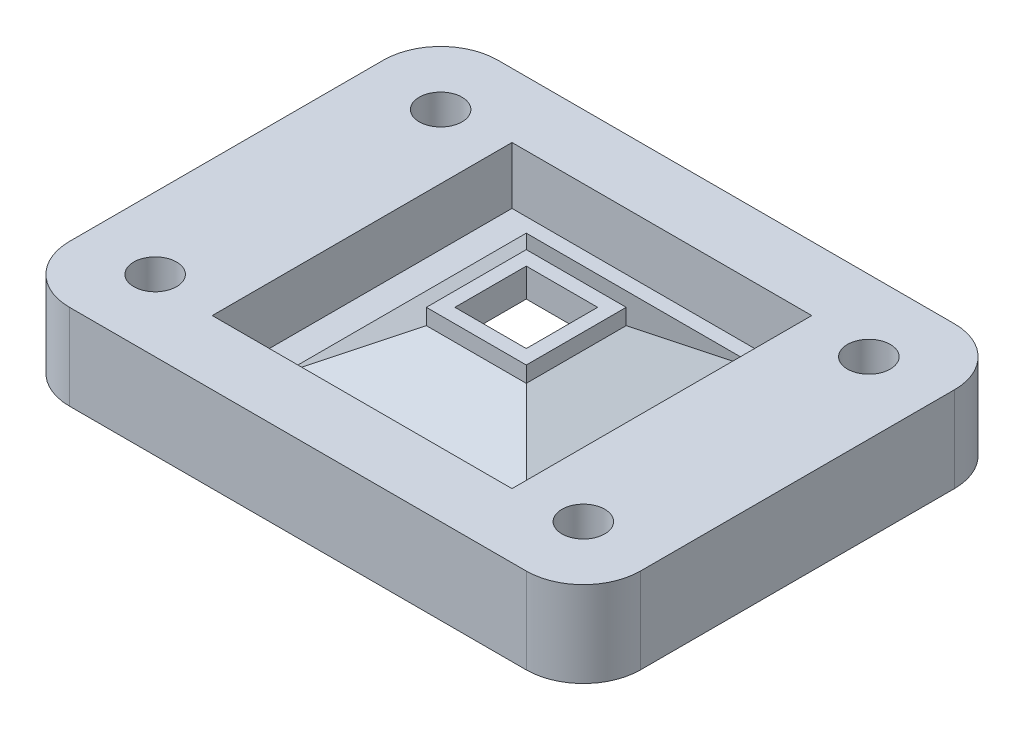
ISO-10303-21;
HEADER;
FILE_DESCRIPTION(('STEP AP214'),'2;1');
FILE_NAME('part.step','',(''),(''),'','','');
FILE_SCHEMA(('AUTOMOTIVE_DESIGN { 1 0 10303 214 1 1 1 1 }'));
ENDSEC;
DATA;
#1=APPLICATION_CONTEXT('core data for automotive mechanical design processes');
#2=APPLICATION_PROTOCOL_DEFINITION('international standard','automotive_design',2000,#1);
#3=PRODUCT_CONTEXT('',#1,'mechanical');
#4=PRODUCT('Part','Part','',(#3));
#5=PRODUCT_RELATED_PRODUCT_CATEGORY('part','',(#4));
#6=PRODUCT_DEFINITION_FORMATION('','',#4);
#7=PRODUCT_DEFINITION_CONTEXT('part definition',#1,'design');
#8=PRODUCT_DEFINITION('design','',#6,#7);
#9=PRODUCT_DEFINITION_SHAPE('','',#8);
#10=(LENGTH_UNIT() NAMED_UNIT(*) SI_UNIT(.MILLI.,.METRE.));
#11=(NAMED_UNIT(*) PLANE_ANGLE_UNIT() SI_UNIT($,.RADIAN.));
#12=(NAMED_UNIT(*) SI_UNIT($,.STERADIAN.) SOLID_ANGLE_UNIT());
#13=UNCERTAINTY_MEASURE_WITH_UNIT(LENGTH_MEASURE(1.E-05),#10,'distance_accuracy_value','');
#14=(GEOMETRIC_REPRESENTATION_CONTEXT(3) GLOBAL_UNCERTAINTY_ASSIGNED_CONTEXT((#13)) GLOBAL_UNIT_ASSIGNED_CONTEXT((#10,
#11,#12)) REPRESENTATION_CONTEXT('',''));
#15=CARTESIAN_POINT('',(0.,0.,0.));
#16=DIRECTION('',(0.,0.,1.));
#17=DIRECTION('',(1.,0.,0.));
#18=AXIS2_PLACEMENT_3D('',#15,#16,#17);
#19=CARTESIAN_POINT('',(0.,2.,0.));
#20=DIRECTION('',(0.,-1.,0.));
#21=DIRECTION('',(0.,0.,-1.));
#22=AXIS2_PLACEMENT_3D('',#19,#20,#21);
#23=PLANE('',#22);
#24=DIRECTION('',(-1.,0.,0.));
#25=VECTOR('',#24,1.);
#26=CARTESIAN_POINT('',(16.5,2.,-7.50000000000003));
#27=LINE('',#26,#25);
#28=CARTESIAN_POINT('',(28.5,2.,-7.50000000000003));
#29=VERTEX_POINT('',#28);
#30=CARTESIAN_POINT('',(11.5,2.,-7.50000000000003));
#31=VERTEX_POINT('',#30);
#32=EDGE_CURVE('E396',#29,#31,#27,.T.);
#33=ORIENTED_EDGE('',*,*,#32,.T.);
#34=DIRECTION('',(0.,0.,-1.));
#35=VECTOR('',#34,1.);
#36=CARTESIAN_POINT('',(11.5,2.,-19.5));
#37=LINE('',#36,#35);
#38=CARTESIAN_POINT('',(11.5,2.,-24.5));
#39=VERTEX_POINT('',#38);
#40=EDGE_CURVE('E402',#31,#39,#37,.T.);
#41=ORIENTED_EDGE('',*,*,#40,.T.);
#42=DIRECTION('',(1.,0.,0.));
#43=VECTOR('',#42,1.);
#44=CARTESIAN_POINT('',(23.5,2.,-24.5));
#45=LINE('',#44,#43);
#46=CARTESIAN_POINT('',(28.5,2.,-24.5));
#47=VERTEX_POINT('',#46);
#48=EDGE_CURVE('E400',#39,#47,#45,.T.);
#49=ORIENTED_EDGE('',*,*,#48,.T.);
#50=DIRECTION('',(0.,0.,1.));
#51=VECTOR('',#50,1.);
#52=CARTESIAN_POINT('',(28.5,2.,-12.5));
#53=LINE('',#52,#51);
#54=EDGE_CURVE('E398',#47,#29,#53,.T.);
#55=ORIENTED_EDGE('',*,*,#54,.T.);
#56=EDGE_LOOP('',(#33,#41,#49,#55));
#57=FACE_BOUND('',#56,.T.);
#58=DIRECTION('',(0.,0.,1.));
#59=VECTOR('',#58,1.);
#60=CARTESIAN_POINT('',(9.5,2.,-4.5));
#61=LINE('',#60,#59);
#62=CARTESIAN_POINT('',(9.5,2.,-25.5));
#63=VERTEX_POINT('',#62);
#64=CARTESIAN_POINT('',(9.5,2.,-4.5));
#65=VERTEX_POINT('',#64);
#66=EDGE_CURVE('E253',#63,#65,#61,.T.);
#67=ORIENTED_EDGE('',*,*,#66,.T.);
#68=DIRECTION('',(1.,0.,0.));
#69=VECTOR('',#68,1.);
#70=CARTESIAN_POINT('',(9.5,2.,-4.5));
#71=LINE('',#70,#69);
#72=CARTESIAN_POINT('',(30.5,2.,-4.5));
#73=VERTEX_POINT('',#72);
#74=EDGE_CURVE('E256',#65,#73,#71,.T.);
#75=ORIENTED_EDGE('',*,*,#74,.T.);
#76=DIRECTION('',(0.,0.,-1.));
#77=VECTOR('',#76,1.);
#78=CARTESIAN_POINT('',(30.5,2.,-4.5));
#79=LINE('',#78,#77);
#80=CARTESIAN_POINT('',(30.5,2.,-25.5));
#81=VERTEX_POINT('',#80);
#82=EDGE_CURVE('E260',#73,#81,#79,.T.);
#83=ORIENTED_EDGE('',*,*,#82,.T.);
#84=DIRECTION('',(-1.,0.,0.));
#85=VECTOR('',#84,1.);
#86=CARTESIAN_POINT('',(9.5,2.,-25.5));
#87=LINE('',#86,#85);
#88=EDGE_CURVE('E263',#81,#63,#87,.T.);
#89=ORIENTED_EDGE('',*,*,#88,.T.);
#90=EDGE_LOOP('',(#67,#75,#83,#89));
#91=FACE_BOUND('',#90,.T.);
#92=ADVANCED_FACE('F35',(#57,#91),#23,.F.);
#93=CARTESIAN_POINT('',(0.,6.,0.));
#94=DIRECTION('',(1.,0.,0.));
#95=DIRECTION('',(0.,0.,-1.));
#96=AXIS2_PLACEMENT_3D('',#93,#94,#95);
#97=PLANE('',#96);
#98=DIRECTION('',(0.,0.,1.));
#99=VECTOR('',#98,1.);
#100=CARTESIAN_POINT('',(0.,6.,0.));
#101=LINE('',#100,#99);
#102=CARTESIAN_POINT('',(0.,6.,-26.));
#103=VERTEX_POINT('',#102);
#104=CARTESIAN_POINT('',(0.,6.,-4.));
#105=VERTEX_POINT('',#104);
#106=EDGE_CURVE('E309',#103,#105,#101,.T.);
#107=ORIENTED_EDGE('',*,*,#106,.F.);
#108=DIRECTION('',(0.,-1.,0.));
#109=VECTOR('',#108,1.);
#110=CARTESIAN_POINT('',(0.,6.,-26.));
#111=LINE('',#110,#109);
#112=CARTESIAN_POINT('',(0.,0.,-26.));
#113=VERTEX_POINT('',#112);
#114=EDGE_CURVE('E334',#103,#113,#111,.T.);
#115=ORIENTED_EDGE('',*,*,#114,.T.);
#116=DIRECTION('',(0.,0.,1.));
#117=VECTOR('',#116,1.);
#118=CARTESIAN_POINT('',(0.,0.,0.));
#119=LINE('',#118,#117);
#120=CARTESIAN_POINT('',(0.,0.,-4.));
#121=VERTEX_POINT('',#120);
#122=EDGE_CURVE('E308',#113,#121,#119,.T.);
#123=ORIENTED_EDGE('',*,*,#122,.T.);
#124=DIRECTION('',(0.,-1.,0.));
#125=VECTOR('',#124,1.);
#126=CARTESIAN_POINT('',(0.,6.,-4.));
#127=LINE('',#126,#125);
#128=EDGE_CURVE('E322',#121,#105,#127,.F.);
#129=ORIENTED_EDGE('',*,*,#128,.T.);
#130=EDGE_LOOP('',(#107,#115,#123,#129));
#131=FACE_BOUND('',#130,.T.);
#132=ADVANCED_FACE('F455',(#131),#97,.F.);
#133=CARTESIAN_POINT('',(0.,6.,0.));
#134=DIRECTION('',(0.,0.,-1.));
#135=DIRECTION('',(-1.,0.,0.));
#136=AXIS2_PLACEMENT_3D('',#133,#134,#135);
#137=PLANE('',#136);
#138=DIRECTION('',(1.,0.,0.));
#139=VECTOR('',#138,1.);
#140=CARTESIAN_POINT('',(0.,0.,0.));
#141=LINE('',#140,#139);
#142=CARTESIAN_POINT('',(4.,0.,0.));
#143=VERTEX_POINT('',#142);
#144=CARTESIAN_POINT('',(36.,0.,0.));
#145=VERTEX_POINT('',#144);
#146=EDGE_CURVE('E325',#143,#145,#141,.T.);
#147=ORIENTED_EDGE('',*,*,#146,.T.);
#148=DIRECTION('',(0.,-1.,0.));
#149=VECTOR('',#148,1.);
#150=CARTESIAN_POINT('',(36.,6.,0.));
#151=LINE('',#150,#149);
#152=CARTESIAN_POINT('',(36.,6.,0.));
#153=VERTEX_POINT('',#152);
#154=EDGE_CURVE('E366',#145,#153,#151,.F.);
#155=ORIENTED_EDGE('',*,*,#154,.T.);
#156=DIRECTION('',(1.,0.,0.));
#157=VECTOR('',#156,1.);
#158=CARTESIAN_POINT('',(0.,6.,0.));
#159=LINE('',#158,#157);
#160=CARTESIAN_POINT('',(4.,6.,0.));
#161=VERTEX_POINT('',#160);
#162=EDGE_CURVE('E312',#161,#153,#159,.T.);
#163=ORIENTED_EDGE('',*,*,#162,.F.);
#164=DIRECTION('',(0.,-1.,0.));
#165=VECTOR('',#164,1.);
#166=CARTESIAN_POINT('',(4.,6.,0.));
#167=LINE('',#166,#165);
#168=EDGE_CURVE('E363',#161,#143,#167,.T.);
#169=ORIENTED_EDGE('',*,*,#168,.T.);
#170=EDGE_LOOP('',(#147,#155,#163,#169));
#171=FACE_BOUND('',#170,.T.);
#172=ADVANCED_FACE('F462',(#171),#137,.F.);
#173=CARTESIAN_POINT('',(40.,6.,0.));
#174=DIRECTION('',(-1.,0.,0.));
#175=DIRECTION('',(0.,0.,1.));
#176=AXIS2_PLACEMENT_3D('',#173,#174,#175);
#177=PLANE('',#176);
#178=DIRECTION('',(0.,0.,-1.));
#179=VECTOR('',#178,1.);
#180=CARTESIAN_POINT('',(40.,0.,0.));
#181=LINE('',#180,#179);
#182=CARTESIAN_POINT('',(40.,0.,-4.));
#183=VERTEX_POINT('',#182);
#184=CARTESIAN_POINT('',(40.,0.,-26.));
#185=VERTEX_POINT('',#184);
#186=EDGE_CURVE('E328',#183,#185,#181,.T.);
#187=ORIENTED_EDGE('',*,*,#186,.T.);
#188=DIRECTION('',(0.,-1.,0.));
#189=VECTOR('',#188,1.);
#190=CARTESIAN_POINT('',(40.,6.,-26.));
#191=LINE('',#190,#189);
#192=CARTESIAN_POINT('',(40.,6.,-26.));
#193=VERTEX_POINT('',#192);
#194=EDGE_CURVE('E361',#185,#193,#191,.F.);
#195=ORIENTED_EDGE('',*,*,#194,.T.);
#196=DIRECTION('',(0.,0.,-1.));
#197=VECTOR('',#196,1.);
#198=CARTESIAN_POINT('',(40.,6.,0.));
#199=LINE('',#198,#197);
#200=CARTESIAN_POINT('',(40.,6.,-4.));
#201=VERTEX_POINT('',#200);
#202=EDGE_CURVE('E316',#201,#193,#199,.T.);
#203=ORIENTED_EDGE('',*,*,#202,.F.);
#204=DIRECTION('',(0.,-1.,0.));
#205=VECTOR('',#204,1.);
#206=CARTESIAN_POINT('',(40.,6.,-4.));
#207=LINE('',#206,#205);
#208=EDGE_CURVE('E358',#201,#183,#207,.T.);
#209=ORIENTED_EDGE('',*,*,#208,.T.);
#210=EDGE_LOOP('',(#187,#195,#203,#209));
#211=FACE_BOUND('',#210,.T.);
#212=ADVANCED_FACE('F513',(#211),#177,.F.);
#213=CARTESIAN_POINT('',(0.,6.,-30.));
#214=DIRECTION('',(0.,0.,1.));
#215=DIRECTION('',(1.,0.,0.));
#216=AXIS2_PLACEMENT_3D('',#213,#214,#215);
#217=PLANE('',#216);
#218=DIRECTION('',(-1.,0.,0.));
#219=VECTOR('',#218,1.);
#220=CARTESIAN_POINT('',(0.,0.,-30.));
#221=LINE('',#220,#219);
#222=CARTESIAN_POINT('',(36.,0.,-30.));
#223=VERTEX_POINT('',#222);
#224=CARTESIAN_POINT('',(4.,0.,-30.));
#225=VERTEX_POINT('',#224);
#226=EDGE_CURVE('E313',#223,#225,#221,.T.);
#227=ORIENTED_EDGE('',*,*,#226,.T.);
#228=DIRECTION('',(0.,-1.,0.));
#229=VECTOR('',#228,1.);
#230=CARTESIAN_POINT('',(4.,6.,-30.));
#231=LINE('',#230,#229);
#232=CARTESIAN_POINT('',(4.,6.,-30.));
#233=VERTEX_POINT('',#232);
#234=EDGE_CURVE('E348',#225,#233,#231,.F.);
#235=ORIENTED_EDGE('',*,*,#234,.T.);
#236=DIRECTION('',(-1.,0.,0.));
#237=VECTOR('',#236,1.);
#238=CARTESIAN_POINT('',(0.,6.,-30.));
#239=LINE('',#238,#237);
#240=CARTESIAN_POINT('',(36.,6.,-30.));
#241=VERTEX_POINT('',#240);
#242=EDGE_CURVE('E319',#241,#233,#239,.T.);
#243=ORIENTED_EDGE('',*,*,#242,.F.);
#244=DIRECTION('',(0.,-1.,0.));
#245=VECTOR('',#244,1.);
#246=CARTESIAN_POINT('',(36.,6.,-30.));
#247=LINE('',#246,#245);
#248=EDGE_CURVE('E345',#241,#223,#247,.T.);
#249=ORIENTED_EDGE('',*,*,#248,.T.);
#250=EDGE_LOOP('',(#227,#235,#243,#249));
#251=FACE_BOUND('',#250,.T.);
#252=ADVANCED_FACE('F506',(#251),#217,.F.);
#253=CARTESIAN_POINT('',(0.,6.,0.));
#254=DIRECTION('',(0.,-1.,0.));
#255=DIRECTION('',(0.,0.,-1.));
#256=AXIS2_PLACEMENT_3D('',#253,#254,#255);
#257=PLANE('',#256);
#258=DIRECTION('',(1.,0.,0.));
#259=VECTOR('',#258,1.);
#260=CARTESIAN_POINT('',(9.5,6.,-4.5));
#261=LINE('',#260,#259);
#262=CARTESIAN_POINT('',(9.5,6.,-4.5));
#263=VERTEX_POINT('',#262);
#264=CARTESIAN_POINT('',(30.5,6.,-4.5));
#265=VERTEX_POINT('',#264);
#266=EDGE_CURVE('E268',#263,#265,#261,.T.);
#267=ORIENTED_EDGE('',*,*,#266,.F.);
#268=DIRECTION('',(0.,0.,1.));
#269=VECTOR('',#268,1.);
#270=CARTESIAN_POINT('',(9.5,6.,-4.5));
#271=LINE('',#270,#269);
#272=CARTESIAN_POINT('',(9.5,6.,-25.5));
#273=VERTEX_POINT('',#272);
#274=EDGE_CURVE('E210',#273,#263,#271,.T.);
#275=ORIENTED_EDGE('',*,*,#274,.F.);
#276=DIRECTION('',(-1.,0.,0.));
#277=VECTOR('',#276,1.);
#278=CARTESIAN_POINT('',(9.5,6.,-25.5));
#279=LINE('',#278,#277);
#280=CARTESIAN_POINT('',(30.5,6.,-25.5));
#281=VERTEX_POINT('',#280);
#282=EDGE_CURVE('E257',#281,#273,#279,.T.);
#283=ORIENTED_EDGE('',*,*,#282,.F.);
#284=DIRECTION('',(0.,0.,-1.));
#285=VECTOR('',#284,1.);
#286=CARTESIAN_POINT('',(30.5,6.,-4.5));
#287=LINE('',#286,#285);
#288=EDGE_CURVE('E271',#265,#281,#287,.T.);
#289=ORIENTED_EDGE('',*,*,#288,.F.);
#290=EDGE_LOOP('',(#267,#275,#283,#289));
#291=FACE_BOUND('',#290,.T.);
#292=CARTESIAN_POINT('',(5.,6.,-25.));
#293=DIRECTION('',(0.,1.,0.));
#294=DIRECTION('',(0.,0.,-1.));
#295=AXIS2_PLACEMENT_3D('',#292,#293,#294);
#296=CIRCLE('',#295,1.5);
#297=CARTESIAN_POINT('',(5.,6.,-26.5));
#298=VERTEX_POINT('',#297);
#299=EDGE_CURVE('E285',#298,#298,#296,.T.);
#300=ORIENTED_EDGE('',*,*,#299,.F.);
#301=EDGE_LOOP('',(#300));
#302=FACE_BOUND('',#301,.T.);
#303=CARTESIAN_POINT('',(35.,6.,-5.));
#304=DIRECTION('',(0.,1.,0.));
#305=DIRECTION('',(0.,0.,-1.));
#306=AXIS2_PLACEMENT_3D('',#303,#304,#305);
#307=CIRCLE('',#306,1.5);
#308=CARTESIAN_POINT('',(35.,6.,-6.5));
#309=VERTEX_POINT('',#308);
#310=EDGE_CURVE('E293',#309,#309,#307,.T.);
#311=ORIENTED_EDGE('',*,*,#310,.F.);
#312=EDGE_LOOP('',(#311));
#313=FACE_BOUND('',#312,.T.);
#314=CARTESIAN_POINT('',(35.,6.,-25.));
#315=DIRECTION('',(0.,1.,0.));
#316=DIRECTION('',(0.,0.,1.));
#317=AXIS2_PLACEMENT_3D('',#314,#315,#316);
#318=CIRCLE('',#317,1.5);
#319=CARTESIAN_POINT('',(35.,6.,-23.5));
#320=VERTEX_POINT('',#319);
#321=EDGE_CURVE('E278',#320,#320,#318,.T.);
#322=ORIENTED_EDGE('',*,*,#321,.F.);
#323=EDGE_LOOP('',(#322));
#324=FACE_BOUND('',#323,.T.);
#325=CARTESIAN_POINT('',(5.,6.,-5.));
#326=DIRECTION('',(0.,1.,0.));
#327=DIRECTION('',(0.,0.,1.));
#328=AXIS2_PLACEMENT_3D('',#325,#326,#327);
#329=CIRCLE('',#328,1.5);
#330=CARTESIAN_POINT('',(5.,6.,-3.5));
#331=VERTEX_POINT('',#330);
#332=EDGE_CURVE('E292',#331,#331,#329,.T.);
#333=ORIENTED_EDGE('',*,*,#332,.F.);
#334=EDGE_LOOP('',(#333));
#335=FACE_BOUND('',#334,.T.);
#336=ORIENTED_EDGE('',*,*,#242,.T.);
#337=CARTESIAN_POINT('',(4.,6.,-26.));
#338=DIRECTION('',(0.,-1.,0.));
#339=DIRECTION('',(0.,0.,-1.));
#340=AXIS2_PLACEMENT_3D('',#337,#338,#339);
#341=CIRCLE('',#340,4.);
#342=EDGE_CURVE('E356',#233,#103,#341,.F.);
#343=ORIENTED_EDGE('',*,*,#342,.T.);
#344=ORIENTED_EDGE('',*,*,#106,.T.);
#345=CARTESIAN_POINT('',(4.,6.,-4.));
#346=DIRECTION('',(0.,-1.,0.));
#347=DIRECTION('',(0.,0.,-1.));
#348=AXIS2_PLACEMENT_3D('',#345,#346,#347);
#349=CIRCLE('',#348,4.);
#350=EDGE_CURVE('E350',#105,#161,#349,.F.);
#351=ORIENTED_EDGE('',*,*,#350,.T.);
#352=ORIENTED_EDGE('',*,*,#162,.T.);
#353=CARTESIAN_POINT('',(36.,6.,-4.));
#354=DIRECTION('',(0.,-1.,0.));
#355=DIRECTION('',(0.,0.,-1.));
#356=AXIS2_PLACEMENT_3D('',#353,#354,#355);
#357=CIRCLE('',#356,4.);
#358=EDGE_CURVE('E352',#153,#201,#357,.F.);
#359=ORIENTED_EDGE('',*,*,#358,.T.);
#360=ORIENTED_EDGE('',*,*,#202,.T.);
#361=CARTESIAN_POINT('',(36.,6.,-26.));
#362=DIRECTION('',(0.,-1.,0.));
#363=DIRECTION('',(0.,0.,-1.));
#364=AXIS2_PLACEMENT_3D('',#361,#362,#363);
#365=CIRCLE('',#364,4.);
#366=EDGE_CURVE('E354',#193,#241,#365,.F.);
#367=ORIENTED_EDGE('',*,*,#366,.T.);
#368=EDGE_LOOP('',(#336,#343,#344,#351,#352,#359,#360,#367));
#369=FACE_BOUND('',#368,.T.);
#370=ADVANCED_FACE('F503',(#291,#302,#313,#324,#335,#369),#257,.F.);
#371=CARTESIAN_POINT('',(0.,0.,0.));
#372=DIRECTION('',(0.,-1.,0.));
#373=DIRECTION('',(0.,0.,-1.));
#374=AXIS2_PLACEMENT_3D('',#371,#372,#373);
#375=PLANE('',#374);
#376=DIRECTION('',(-1.,0.,0.));
#377=VECTOR('',#376,1.);
#378=CARTESIAN_POINT('',(17.5,0.,-25.4282032302755));
#379=LINE('',#378,#377);
#380=CARTESIAN_POINT('',(29.4282032302755,0.,-25.4282032302755));
#381=VERTEX_POINT('',#380);
#382=CARTESIAN_POINT('',(10.5717967697245,0.,-25.4282032302755));
#383=VERTEX_POINT('',#382);
#384=EDGE_CURVE('E368',#381,#383,#379,.T.);
#385=ORIENTED_EDGE('',*,*,#384,.T.);
#386=DIRECTION('',(0.,0.,1.));
#387=VECTOR('',#386,1.);
#388=CARTESIAN_POINT('',(10.5717967697245,0.,-13.5));
#389=LINE('',#388,#387);
#390=CARTESIAN_POINT('',(10.5717967697245,0.,-6.5717967697245));
#391=VERTEX_POINT('',#390);
#392=EDGE_CURVE('E374',#383,#391,#389,.T.);
#393=ORIENTED_EDGE('',*,*,#392,.T.);
#394=DIRECTION('',(1.,0.,0.));
#395=VECTOR('',#394,1.);
#396=CARTESIAN_POINT('',(22.5,0.,-6.5717967697245));
#397=LINE('',#396,#395);
#398=CARTESIAN_POINT('',(29.4282032302755,0.,-6.5717967697245));
#399=VERTEX_POINT('',#398);
#400=EDGE_CURVE('E372',#391,#399,#397,.T.);
#401=ORIENTED_EDGE('',*,*,#400,.T.);
#402=DIRECTION('',(0.,0.,-1.));
#403=VECTOR('',#402,1.);
#404=CARTESIAN_POINT('',(29.4282032302755,0.,-18.5));
#405=LINE('',#404,#403);
#406=EDGE_CURVE('E370',#399,#381,#405,.T.);
#407=ORIENTED_EDGE('',*,*,#406,.T.);
#408=EDGE_LOOP('',(#385,#393,#401,#407));
#409=FACE_BOUND('',#408,.T.);
#410=CARTESIAN_POINT('',(5.,0.,-25.));
#411=DIRECTION('',(0.,-1.,0.));
#412=DIRECTION('',(0.,0.,-1.));
#413=AXIS2_PLACEMENT_3D('',#410,#411,#412);
#414=CIRCLE('',#413,1.5);
#415=CARTESIAN_POINT('',(5.,0.,-26.5));
#416=VERTEX_POINT('',#415);
#417=EDGE_CURVE('E288',#416,#416,#414,.F.);
#418=ORIENTED_EDGE('',*,*,#417,.T.);
#419=EDGE_LOOP('',(#418));
#420=FACE_BOUND('',#419,.T.);
#421=CARTESIAN_POINT('',(35.,0.,-5.));
#422=DIRECTION('',(0.,-1.,0.));
#423=DIRECTION('',(0.,0.,-1.));
#424=AXIS2_PLACEMENT_3D('',#421,#422,#423);
#425=CIRCLE('',#424,1.5);
#426=CARTESIAN_POINT('',(35.,0.,-6.5));
#427=VERTEX_POINT('',#426);
#428=EDGE_CURVE('E289',#427,#427,#425,.F.);
#429=ORIENTED_EDGE('',*,*,#428,.T.);
#430=EDGE_LOOP('',(#429));
#431=FACE_BOUND('',#430,.T.);
#432=CARTESIAN_POINT('',(35.,0.,-25.));
#433=DIRECTION('',(0.,-1.,0.));
#434=DIRECTION('',(0.,0.,-1.));
#435=AXIS2_PLACEMENT_3D('',#432,#433,#434);
#436=CIRCLE('',#435,1.5);
#437=CARTESIAN_POINT('',(35.,0.,-26.5));
#438=VERTEX_POINT('',#437);
#439=EDGE_CURVE('E296',#438,#438,#436,.F.);
#440=ORIENTED_EDGE('',*,*,#439,.T.);
#441=EDGE_LOOP('',(#440));
#442=FACE_BOUND('',#441,.T.);
#443=CARTESIAN_POINT('',(5.,0.,-5.));
#444=DIRECTION('',(0.,-1.,0.));
#445=DIRECTION('',(0.,0.,-1.));
#446=AXIS2_PLACEMENT_3D('',#443,#444,#445);
#447=CIRCLE('',#446,1.5);
#448=CARTESIAN_POINT('',(5.,0.,-6.5));
#449=VERTEX_POINT('',#448);
#450=EDGE_CURVE('E305',#449,#449,#447,.F.);
#451=ORIENTED_EDGE('',*,*,#450,.T.);
#452=EDGE_LOOP('',(#451));
#453=FACE_BOUND('',#452,.T.);
#454=ORIENTED_EDGE('',*,*,#122,.F.);
#455=CARTESIAN_POINT('',(4.,0.,-26.));
#456=DIRECTION('',(0.,-1.,0.));
#457=DIRECTION('',(0.,0.,-1.));
#458=AXIS2_PLACEMENT_3D('',#455,#456,#457);
#459=CIRCLE('',#458,4.);
#460=EDGE_CURVE('E343',#113,#225,#459,.T.);
#461=ORIENTED_EDGE('',*,*,#460,.T.);
#462=ORIENTED_EDGE('',*,*,#226,.F.);
#463=CARTESIAN_POINT('',(36.,0.,-26.));
#464=DIRECTION('',(0.,-1.,0.));
#465=DIRECTION('',(0.,0.,-1.));
#466=AXIS2_PLACEMENT_3D('',#463,#464,#465);
#467=CIRCLE('',#466,4.);
#468=EDGE_CURVE('E341',#223,#185,#467,.T.);
#469=ORIENTED_EDGE('',*,*,#468,.T.);
#470=ORIENTED_EDGE('',*,*,#186,.F.);
#471=CARTESIAN_POINT('',(36.,0.,-4.));
#472=DIRECTION('',(0.,-1.,0.));
#473=DIRECTION('',(0.,0.,-1.));
#474=AXIS2_PLACEMENT_3D('',#471,#472,#473);
#475=CIRCLE('',#474,4.);
#476=EDGE_CURVE('E339',#183,#145,#475,.T.);
#477=ORIENTED_EDGE('',*,*,#476,.T.);
#478=ORIENTED_EDGE('',*,*,#146,.F.);
#479=CARTESIAN_POINT('',(4.,0.,-4.));
#480=DIRECTION('',(0.,-1.,0.));
#481=DIRECTION('',(0.,0.,-1.));
#482=AXIS2_PLACEMENT_3D('',#479,#480,#481);
#483=CIRCLE('',#482,4.);
#484=EDGE_CURVE('E337',#143,#121,#483,.T.);
#485=ORIENTED_EDGE('',*,*,#484,.T.);
#486=EDGE_LOOP('',(#454,#461,#462,#469,#470,#477,#478,#485));
#487=FACE_BOUND('',#486,.T.);
#488=ADVANCED_FACE('F501',(#409,#420,#431,#442,#453,#487),#375,.T.);
#489=CARTESIAN_POINT('',(5.,-4.24264068711928,-5.));
#490=DIRECTION('',(0.,1.,0.));
#491=DIRECTION('',(0.,0.,1.));
#492=AXIS2_PLACEMENT_3D('',#489,#490,#491);
#493=CYLINDRICAL_SURFACE('',#492,1.5);
#494=ORIENTED_EDGE('',*,*,#332,.T.);
#495=EDGE_LOOP('',(#494));
#496=FACE_BOUND('',#495,.T.);
#497=ORIENTED_EDGE('',*,*,#450,.F.);
#498=EDGE_LOOP('',(#497));
#499=FACE_BOUND('',#498,.T.);
#500=ADVANCED_FACE('F497',(#496,#499),#493,.F.);
#501=CARTESIAN_POINT('',(35.,-4.24264068711928,-25.));
#502=DIRECTION('',(0.,1.,0.));
#503=DIRECTION('',(0.,0.,1.));
#504=AXIS2_PLACEMENT_3D('',#501,#502,#503);
#505=CYLINDRICAL_SURFACE('',#504,1.5);
#506=ORIENTED_EDGE('',*,*,#321,.T.);
#507=EDGE_LOOP('',(#506));
#508=FACE_BOUND('',#507,.T.);
#509=ORIENTED_EDGE('',*,*,#439,.F.);
#510=EDGE_LOOP('',(#509));
#511=FACE_BOUND('',#510,.T.);
#512=ADVANCED_FACE('F493',(#508,#511),#505,.F.);
#513=CARTESIAN_POINT('',(35.,-4.24264068711928,-5.));
#514=DIRECTION('',(0.,1.,0.));
#515=DIRECTION('',(0.,0.,1.));
#516=AXIS2_PLACEMENT_3D('',#513,#514,#515);
#517=CYLINDRICAL_SURFACE('',#516,1.5);
#518=ORIENTED_EDGE('',*,*,#310,.T.);
#519=EDGE_LOOP('',(#518));
#520=FACE_BOUND('',#519,.T.);
#521=ORIENTED_EDGE('',*,*,#428,.F.);
#522=EDGE_LOOP('',(#521));
#523=FACE_BOUND('',#522,.T.);
#524=ADVANCED_FACE('F489',(#520,#523),#517,.F.);
#525=CARTESIAN_POINT('',(5.,-4.24264068711928,-25.));
#526=DIRECTION('',(0.,1.,0.));
#527=DIRECTION('',(0.,0.,1.));
#528=AXIS2_PLACEMENT_3D('',#525,#526,#527);
#529=CYLINDRICAL_SURFACE('',#528,1.5);
#530=ORIENTED_EDGE('',*,*,#299,.T.);
#531=EDGE_LOOP('',(#530));
#532=FACE_BOUND('',#531,.T.);
#533=ORIENTED_EDGE('',*,*,#417,.F.);
#534=EDGE_LOOP('',(#533));
#535=FACE_BOUND('',#534,.T.);
#536=ADVANCED_FACE('F485',(#532,#535),#529,.F.);
#537=CARTESIAN_POINT('',(4.,6.,-26.));
#538=DIRECTION('',(0.,-1.,0.));
#539=DIRECTION('',(0.,0.,-1.));
#540=AXIS2_PLACEMENT_3D('',#537,#538,#539);
#541=CYLINDRICAL_SURFACE('',#540,4.);
#542=ORIENTED_EDGE('',*,*,#342,.F.);
#543=ORIENTED_EDGE('',*,*,#234,.F.);
#544=ORIENTED_EDGE('',*,*,#460,.F.);
#545=ORIENTED_EDGE('',*,*,#114,.F.);
#546=EDGE_LOOP('',(#542,#543,#544,#545));
#547=FACE_BOUND('',#546,.T.);
#548=ADVANCED_FACE('F488',(#547),#541,.T.);
#549=CARTESIAN_POINT('',(36.,6.,-26.));
#550=DIRECTION('',(0.,-1.,0.));
#551=DIRECTION('',(0.,0.,-1.));
#552=AXIS2_PLACEMENT_3D('',#549,#550,#551);
#553=CYLINDRICAL_SURFACE('',#552,4.);
#554=ORIENTED_EDGE('',*,*,#366,.F.);
#555=ORIENTED_EDGE('',*,*,#194,.F.);
#556=ORIENTED_EDGE('',*,*,#468,.F.);
#557=ORIENTED_EDGE('',*,*,#248,.F.);
#558=EDGE_LOOP('',(#554,#555,#556,#557));
#559=FACE_BOUND('',#558,.T.);
#560=ADVANCED_FACE('F523',(#559),#553,.T.);
#561=CARTESIAN_POINT('',(36.,6.,-4.));
#562=DIRECTION('',(0.,-1.,0.));
#563=DIRECTION('',(0.,0.,-1.));
#564=AXIS2_PLACEMENT_3D('',#561,#562,#563);
#565=CYLINDRICAL_SURFACE('',#564,4.);
#566=ORIENTED_EDGE('',*,*,#358,.F.);
#567=ORIENTED_EDGE('',*,*,#154,.F.);
#568=ORIENTED_EDGE('',*,*,#476,.F.);
#569=ORIENTED_EDGE('',*,*,#208,.F.);
#570=EDGE_LOOP('',(#566,#567,#568,#569));
#571=FACE_BOUND('',#570,.T.);
#572=ADVANCED_FACE('F527',(#571),#565,.T.);
#573=CARTESIAN_POINT('',(4.,6.,-4.));
#574=DIRECTION('',(0.,-1.,0.));
#575=DIRECTION('',(0.,0.,-1.));
#576=AXIS2_PLACEMENT_3D('',#573,#574,#575);
#577=CYLINDRICAL_SURFACE('',#576,4.);
#578=ORIENTED_EDGE('',*,*,#350,.F.);
#579=ORIENTED_EDGE('',*,*,#128,.F.);
#580=ORIENTED_EDGE('',*,*,#484,.F.);
#581=ORIENTED_EDGE('',*,*,#168,.F.);
#582=EDGE_LOOP('',(#578,#579,#580,#581));
#583=FACE_BOUND('',#582,.T.);
#584=ADVANCED_FACE('F483',(#583),#577,.T.);
#585=CARTESIAN_POINT('',(9.5,2.,-4.5));
#586=DIRECTION('',(-1.,0.,0.));
#587=DIRECTION('',(0.,0.,1.));
#588=AXIS2_PLACEMENT_3D('',#585,#586,#587);
#589=PLANE('',#588);
#590=ORIENTED_EDGE('',*,*,#274,.T.);
#591=DIRECTION('',(0.,1.,0.));
#592=VECTOR('',#591,1.);
#593=CARTESIAN_POINT('',(9.5,2.,-4.5));
#594=LINE('',#593,#592);
#595=EDGE_CURVE('E266',#65,#263,#594,.T.);
#596=ORIENTED_EDGE('',*,*,#595,.F.);
#597=ORIENTED_EDGE('',*,*,#66,.F.);
#598=DIRECTION('',(0.,1.,0.));
#599=VECTOR('',#598,1.);
#600=CARTESIAN_POINT('',(9.5,2.,-25.5));
#601=LINE('',#600,#599);
#602=EDGE_CURVE('E276',#63,#273,#601,.T.);
#603=ORIENTED_EDGE('',*,*,#602,.T.);
#604=EDGE_LOOP('',(#590,#596,#597,#603));
#605=FACE_BOUND('',#604,.T.);
#606=ADVANCED_FACE('F472',(#605),#589,.F.);
#607=CARTESIAN_POINT('',(9.5,2.,-25.5));
#608=DIRECTION('',(0.,0.,-1.));
#609=DIRECTION('',(-1.,0.,0.));
#610=AXIS2_PLACEMENT_3D('',#607,#608,#609);
#611=PLANE('',#610);
#612=ORIENTED_EDGE('',*,*,#282,.T.);
#613=ORIENTED_EDGE('',*,*,#602,.F.);
#614=ORIENTED_EDGE('',*,*,#88,.F.);
#615=DIRECTION('',(0.,1.,0.));
#616=VECTOR('',#615,1.);
#617=CARTESIAN_POINT('',(30.5,2.,-25.5));
#618=LINE('',#617,#616);
#619=EDGE_CURVE('E279',#81,#281,#618,.T.);
#620=ORIENTED_EDGE('',*,*,#619,.T.);
#621=EDGE_LOOP('',(#612,#613,#614,#620));
#622=FACE_BOUND('',#621,.T.);
#623=ADVANCED_FACE('F468',(#622),#611,.F.);
#624=CARTESIAN_POINT('',(30.5,2.,-4.5));
#625=DIRECTION('',(1.,0.,0.));
#626=DIRECTION('',(0.,0.,-1.));
#627=AXIS2_PLACEMENT_3D('',#624,#625,#626);
#628=PLANE('',#627);
#629=ORIENTED_EDGE('',*,*,#288,.T.);
#630=ORIENTED_EDGE('',*,*,#619,.F.);
#631=ORIENTED_EDGE('',*,*,#82,.F.);
#632=DIRECTION('',(0.,1.,0.));
#633=VECTOR('',#632,1.);
#634=CARTESIAN_POINT('',(30.5,2.,-4.5));
#635=LINE('',#634,#633);
#636=EDGE_CURVE('E281',#73,#265,#635,.T.);
#637=ORIENTED_EDGE('',*,*,#636,.T.);
#638=EDGE_LOOP('',(#629,#630,#631,#637));
#639=FACE_BOUND('',#638,.T.);
#640=ADVANCED_FACE('F471',(#639),#628,.F.);
#641=CARTESIAN_POINT('',(9.5,2.,-4.5));
#642=DIRECTION('',(0.,0.,1.));
#643=DIRECTION('',(1.,0.,0.));
#644=AXIS2_PLACEMENT_3D('',#641,#642,#643);
#645=PLANE('',#644);
#646=ORIENTED_EDGE('',*,*,#266,.T.);
#647=ORIENTED_EDGE('',*,*,#636,.F.);
#648=ORIENTED_EDGE('',*,*,#74,.F.);
#649=ORIENTED_EDGE('',*,*,#595,.T.);
#650=EDGE_LOOP('',(#646,#647,#648,#649));
#651=FACE_BOUND('',#650,.T.);
#652=ADVANCED_FACE('F476',(#651),#645,.F.);
#653=CARTESIAN_POINT('',(17.5,-7.07106781186548,-13.5));
#654=DIRECTION('',(0.,0.,1.));
#655=DIRECTION('',(1.,0.,0.));
#656=AXIS2_PLACEMENT_3D('',#653,#654,#655);
#657=PLANE('',#656);
#658=DIRECTION('',(0.,1.,0.));
#659=VECTOR('',#658,1.);
#660=CARTESIAN_POINT('',(22.5,-7.07106781186548,-13.5));
#661=LINE('',#660,#659);
#662=CARTESIAN_POINT('',(22.5,4.00000000000001,-13.5));
#663=VERTEX_POINT('',#662);
#664=CARTESIAN_POINT('',(22.5,6.,-13.5));
#665=VERTEX_POINT('',#664);
#666=EDGE_CURVE('E248',#663,#665,#661,.T.);
#667=ORIENTED_EDGE('',*,*,#666,.F.);
#668=DIRECTION('',(-1.,0.,0.));
#669=VECTOR('',#668,1.);
#670=CARTESIAN_POINT('',(17.5,4.00000000000001,-13.5));
#671=LINE('',#670,#669);
#672=CARTESIAN_POINT('',(17.5,4.00000000000001,-13.5));
#673=VERTEX_POINT('',#672);
#674=EDGE_CURVE('E206',#663,#673,#671,.T.);
#675=ORIENTED_EDGE('',*,*,#674,.T.);
#676=DIRECTION('',(0.,1.,0.));
#677=VECTOR('',#676,1.);
#678=CARTESIAN_POINT('',(17.5,-7.07106781186548,-13.5));
#679=LINE('',#678,#677);
#680=CARTESIAN_POINT('',(17.5,6.,-13.5));
#681=VERTEX_POINT('',#680);
#682=EDGE_CURVE('E198',#673,#681,#679,.T.);
#683=ORIENTED_EDGE('',*,*,#682,.T.);
#684=DIRECTION('',(1.,0.,0.));
#685=VECTOR('',#684,1.);
#686=CARTESIAN_POINT('',(17.5,6.,-13.5));
#687=LINE('',#686,#685);
#688=EDGE_CURVE('E203',#681,#665,#687,.T.);
#689=ORIENTED_EDGE('',*,*,#688,.T.);
#690=EDGE_LOOP('',(#667,#675,#683,#689));
#691=FACE_BOUND('',#690,.T.);
#692=ADVANCED_FACE('F201',(#691),#657,.F.);
#693=CARTESIAN_POINT('',(22.5,-7.07106781186548,-13.5));
#694=DIRECTION('',(1.,0.,0.));
#695=DIRECTION('',(0.,0.,-1.));
#696=AXIS2_PLACEMENT_3D('',#693,#694,#695);
#697=PLANE('',#696);
#698=DIRECTION('',(0.,1.,0.));
#699=VECTOR('',#698,1.);
#700=CARTESIAN_POINT('',(22.5,-7.07106781186548,-18.5));
#701=LINE('',#700,#699);
#702=CARTESIAN_POINT('',(22.5,4.00000000000001,-18.5));
#703=VERTEX_POINT('',#702);
#704=CARTESIAN_POINT('',(22.5,6.,-18.5));
#705=VERTEX_POINT('',#704);
#706=EDGE_CURVE('E250',#703,#705,#701,.T.);
#707=ORIENTED_EDGE('',*,*,#706,.F.);
#708=DIRECTION('',(0.,0.,1.));
#709=VECTOR('',#708,1.);
#710=CARTESIAN_POINT('',(22.5,4.00000000000001,-13.5));
#711=LINE('',#710,#709);
#712=EDGE_CURVE('E380',#703,#663,#711,.T.);
#713=ORIENTED_EDGE('',*,*,#712,.T.);
#714=ORIENTED_EDGE('',*,*,#666,.T.);
#715=DIRECTION('',(0.,0.,-1.));
#716=VECTOR('',#715,1.);
#717=CARTESIAN_POINT('',(22.5,6.,-18.5));
#718=LINE('',#717,#716);
#719=EDGE_CURVE('E224',#665,#705,#718,.T.);
#720=ORIENTED_EDGE('',*,*,#719,.T.);
#721=EDGE_LOOP('',(#707,#713,#714,#720));
#722=FACE_BOUND('',#721,.T.);
#723=ADVANCED_FACE('F617',(#722),#697,.F.);
#724=CARTESIAN_POINT('',(17.5,-7.07106781186548,-18.5));
#725=DIRECTION('',(0.,0.,-1.));
#726=DIRECTION('',(-1.,0.,0.));
#727=AXIS2_PLACEMENT_3D('',#724,#725,#726);
#728=PLANE('',#727);
#729=DIRECTION('',(0.,1.,0.));
#730=VECTOR('',#729,1.);
#731=CARTESIAN_POINT('',(17.5,-7.07106781186548,-18.5));
#732=LINE('',#731,#730);
#733=CARTESIAN_POINT('',(17.5,4.00000000000001,-18.5));
#734=VERTEX_POINT('',#733);
#735=CARTESIAN_POINT('',(17.5,6.,-18.5));
#736=VERTEX_POINT('',#735);
#737=EDGE_CURVE('E211',#734,#736,#732,.T.);
#738=ORIENTED_EDGE('',*,*,#737,.F.);
#739=DIRECTION('',(1.,0.,0.));
#740=VECTOR('',#739,1.);
#741=CARTESIAN_POINT('',(22.5,4.00000000000001,-18.5));
#742=LINE('',#741,#740);
#743=EDGE_CURVE('E382',#734,#703,#742,.T.);
#744=ORIENTED_EDGE('',*,*,#743,.T.);
#745=ORIENTED_EDGE('',*,*,#706,.T.);
#746=DIRECTION('',(-1.,0.,0.));
#747=VECTOR('',#746,1.);
#748=CARTESIAN_POINT('',(17.5,6.,-18.5));
#749=LINE('',#748,#747);
#750=EDGE_CURVE('E226',#705,#736,#749,.T.);
#751=ORIENTED_EDGE('',*,*,#750,.T.);
#752=EDGE_LOOP('',(#738,#744,#745,#751));
#753=FACE_BOUND('',#752,.T.);
#754=ADVANCED_FACE('F610',(#753),#728,.F.);
#755=CARTESIAN_POINT('',(17.5,-7.07106781186548,-13.5));
#756=DIRECTION('',(-1.,0.,0.));
#757=DIRECTION('',(0.,0.,1.));
#758=AXIS2_PLACEMENT_3D('',#755,#756,#757);
#759=PLANE('',#758);
#760=ORIENTED_EDGE('',*,*,#682,.F.);
#761=DIRECTION('',(0.,0.,-1.));
#762=VECTOR('',#761,1.);
#763=CARTESIAN_POINT('',(17.5,4.00000000000001,-18.5));
#764=LINE('',#763,#762);
#765=EDGE_CURVE('E377',#673,#734,#764,.T.);
#766=ORIENTED_EDGE('',*,*,#765,.T.);
#767=ORIENTED_EDGE('',*,*,#737,.T.);
#768=DIRECTION('',(0.,0.,1.));
#769=VECTOR('',#768,1.);
#770=CARTESIAN_POINT('',(17.5,6.,-18.5));
#771=LINE('',#770,#769);
#772=EDGE_CURVE('E214',#736,#681,#771,.T.);
#773=ORIENTED_EDGE('',*,*,#772,.T.);
#774=EDGE_LOOP('',(#760,#766,#767,#773));
#775=FACE_BOUND('',#774,.T.);
#776=ADVANCED_FACE('F215',(#775),#759,.F.);
#777=CARTESIAN_POINT('',(0.,6.,0.));
#778=DIRECTION('',(0.,1.,0.));
#779=DIRECTION('',(0.,0.,1.));
#780=AXIS2_PLACEMENT_3D('',#777,#778,#779);
#781=PLANE('',#780);
#782=DIRECTION('',(0.,0.,1.));
#783=VECTOR('',#782,1.);
#784=CARTESIAN_POINT('',(16.5,6.,-19.5));
#785=LINE('',#784,#783);
#786=CARTESIAN_POINT('',(16.5,6.,-19.5));
#787=VERTEX_POINT('',#786);
#788=CARTESIAN_POINT('',(16.5,6.,-12.5));
#789=VERTEX_POINT('',#788);
#790=EDGE_CURVE('E230',#787,#789,#785,.T.);
#791=ORIENTED_EDGE('',*,*,#790,.T.);
#792=DIRECTION('',(1.,0.,0.));
#793=VECTOR('',#792,1.);
#794=CARTESIAN_POINT('',(16.5,6.,-12.5));
#795=LINE('',#794,#793);
#796=CARTESIAN_POINT('',(23.5,6.,-12.5));
#797=VERTEX_POINT('',#796);
#798=EDGE_CURVE('E233',#789,#797,#795,.T.);
#799=ORIENTED_EDGE('',*,*,#798,.T.);
#800=DIRECTION('',(0.,0.,-1.));
#801=VECTOR('',#800,1.);
#802=CARTESIAN_POINT('',(23.5,6.,-12.5));
#803=LINE('',#802,#801);
#804=CARTESIAN_POINT('',(23.5,6.,-19.5));
#805=VERTEX_POINT('',#804);
#806=EDGE_CURVE('E235',#797,#805,#803,.T.);
#807=ORIENTED_EDGE('',*,*,#806,.T.);
#808=DIRECTION('',(-1.,0.,0.));
#809=VECTOR('',#808,1.);
#810=CARTESIAN_POINT('',(23.5,6.,-19.5));
#811=LINE('',#810,#809);
#812=EDGE_CURVE('E237',#805,#787,#811,.T.);
#813=ORIENTED_EDGE('',*,*,#812,.T.);
#814=EDGE_LOOP('',(#791,#799,#807,#813));
#815=FACE_BOUND('',#814,.T.);
#816=ORIENTED_EDGE('',*,*,#688,.F.);
#817=ORIENTED_EDGE('',*,*,#772,.F.);
#818=ORIENTED_EDGE('',*,*,#750,.F.);
#819=ORIENTED_EDGE('',*,*,#719,.F.);
#820=EDGE_LOOP('',(#816,#817,#818,#819));
#821=FACE_BOUND('',#820,.T.);
#822=ADVANCED_FACE('F222',(#815,#821),#781,.T.);
#823=CARTESIAN_POINT('',(16.5,6.,-19.5));
#824=DIRECTION('',(1.,0.,0.));
#825=DIRECTION('',(0.,0.,-1.));
#826=AXIS2_PLACEMENT_3D('',#823,#824,#825);
#827=PLANE('',#826);
#828=DIRECTION('',(0.,-1.,0.));
#829=VECTOR('',#828,1.);
#830=CARTESIAN_POINT('',(16.5,6.,-19.5));
#831=LINE('',#830,#829);
#832=CARTESIAN_POINT('',(16.5,4.88675134594814,-19.5));
#833=VERTEX_POINT('',#832);
#834=EDGE_CURVE('E239',#787,#833,#831,.T.);
#835=ORIENTED_EDGE('',*,*,#834,.T.);
#836=DIRECTION('',(0.,0.,1.));
#837=VECTOR('',#836,1.);
#838=CARTESIAN_POINT('',(16.5,4.88675134594814,-12.5));
#839=LINE('',#838,#837);
#840=CARTESIAN_POINT('',(16.5,4.88675134594814,-12.5));
#841=VERTEX_POINT('',#840);
#842=EDGE_CURVE('E384',#833,#841,#839,.T.);
#843=ORIENTED_EDGE('',*,*,#842,.T.);
#844=DIRECTION('',(0.,-1.,0.));
#845=VECTOR('',#844,1.);
#846=CARTESIAN_POINT('',(16.5,6.,-12.5));
#847=LINE('',#846,#845);
#848=EDGE_CURVE('E246',#789,#841,#847,.T.);
#849=ORIENTED_EDGE('',*,*,#848,.F.);
#850=ORIENTED_EDGE('',*,*,#790,.F.);
#851=EDGE_LOOP('',(#835,#843,#849,#850));
#852=FACE_BOUND('',#851,.T.);
#853=ADVANCED_FACE('F435',(#852),#827,.F.);
#854=CARTESIAN_POINT('',(16.5,6.,-12.5));
#855=DIRECTION('',(0.,0.,-1.));
#856=DIRECTION('',(-1.,0.,0.));
#857=AXIS2_PLACEMENT_3D('',#854,#855,#856);
#858=PLANE('',#857);
#859=ORIENTED_EDGE('',*,*,#848,.T.);
#860=DIRECTION('',(1.,0.,0.));
#861=VECTOR('',#860,1.);
#862=CARTESIAN_POINT('',(23.5,4.88675134594814,-12.5));
#863=LINE('',#862,#861);
#864=CARTESIAN_POINT('',(23.5,4.88675134594814,-12.5));
#865=VERTEX_POINT('',#864);
#866=EDGE_CURVE('E11',#841,#865,#863,.T.);
#867=ORIENTED_EDGE('',*,*,#866,.T.);
#868=DIRECTION('',(0.,-1.,0.));
#869=VECTOR('',#868,1.);
#870=CARTESIAN_POINT('',(23.5,6.,-12.5));
#871=LINE('',#870,#869);
#872=EDGE_CURVE('E244',#797,#865,#871,.T.);
#873=ORIENTED_EDGE('',*,*,#872,.F.);
#874=ORIENTED_EDGE('',*,*,#798,.F.);
#875=EDGE_LOOP('',(#859,#867,#873,#874));
#876=FACE_BOUND('',#875,.T.);
#877=ADVANCED_FACE('F438',(#876),#858,.F.);
#878=CARTESIAN_POINT('',(23.5,6.,-12.5));
#879=DIRECTION('',(-1.,0.,0.));
#880=DIRECTION('',(0.,0.,1.));
#881=AXIS2_PLACEMENT_3D('',#878,#879,#880);
#882=PLANE('',#881);
#883=ORIENTED_EDGE('',*,*,#872,.T.);
#884=DIRECTION('',(0.,0.,-1.));
#885=VECTOR('',#884,1.);
#886=CARTESIAN_POINT('',(23.5,4.88675134594814,-19.5));
#887=LINE('',#886,#885);
#888=CARTESIAN_POINT('',(23.5,4.88675134594814,-19.5));
#889=VERTEX_POINT('',#888);
#890=EDGE_CURVE('E44',#865,#889,#887,.T.);
#891=ORIENTED_EDGE('',*,*,#890,.T.);
#892=DIRECTION('',(0.,-1.,0.));
#893=VECTOR('',#892,1.);
#894=CARTESIAN_POINT('',(23.5,6.,-19.5));
#895=LINE('',#894,#893);
#896=EDGE_CURVE('E242',#805,#889,#895,.T.);
#897=ORIENTED_EDGE('',*,*,#896,.F.);
#898=ORIENTED_EDGE('',*,*,#806,.F.);
#899=EDGE_LOOP('',(#883,#891,#897,#898));
#900=FACE_BOUND('',#899,.T.);
#901=ADVANCED_FACE('F444',(#900),#882,.F.);
#902=CARTESIAN_POINT('',(23.5,6.,-19.5));
#903=DIRECTION('',(0.,0.,1.));
#904=DIRECTION('',(1.,0.,0.));
#905=AXIS2_PLACEMENT_3D('',#902,#903,#904);
#906=PLANE('',#905);
#907=ORIENTED_EDGE('',*,*,#896,.T.);
#908=DIRECTION('',(-1.,0.,0.));
#909=VECTOR('',#908,1.);
#910=CARTESIAN_POINT('',(16.5,4.88675134594814,-19.5));
#911=LINE('',#910,#909);
#912=EDGE_CURVE('E405',#889,#833,#911,.T.);
#913=ORIENTED_EDGE('',*,*,#912,.T.);
#914=ORIENTED_EDGE('',*,*,#834,.F.);
#915=ORIENTED_EDGE('',*,*,#812,.F.);
#916=EDGE_LOOP('',(#907,#913,#914,#915));
#917=FACE_BOUND('',#916,.T.);
#918=ADVANCED_FACE('F443',(#917),#906,.F.);
#919=CARTESIAN_POINT('',(29.4282032302755,0.,0.));
#920=DIRECTION('',(-0.500000000000001,-0.866025403784438,0.));
#921=DIRECTION('',(0.,0.,1.));
#922=AXIS2_PLACEMENT_3D('',#919,#920,#921);
#923=PLANE('',#922);
#924=DIRECTION('',(-0.654653670707977,0.377964473009228,-0.654653670707977));
#925=VECTOR('',#924,1.);
#926=CARTESIAN_POINT('',(16.816116131586,7.28159188147141,-19.183883868414));
#927=LINE('',#926,#925);
#928=EDGE_CURVE('E389',#663,#399,#927,.F.);
#929=ORIENTED_EDGE('',*,*,#928,.F.);
#930=ORIENTED_EDGE('',*,*,#712,.F.);
#931=DIRECTION('',(-0.654653670707977,0.377964473009228,0.654653670707977));
#932=VECTOR('',#931,1.);
#933=CARTESIAN_POINT('',(18.5304018458717,6.29184856286061,-14.5304018458717));
#934=LINE('',#933,#932);
#935=EDGE_CURVE('E220',#381,#703,#934,.T.);
#936=ORIENTED_EDGE('',*,*,#935,.F.);
#937=ORIENTED_EDGE('',*,*,#406,.F.);
#938=EDGE_LOOP('',(#929,#930,#936,#937));
#939=FACE_BOUND('',#938,.T.);
#940=ADVANCED_FACE('F451',(#939),#923,.T.);
#941=CARTESIAN_POINT('',(0.,0.,-25.4282032302755));
#942=DIRECTION('',(0.,-0.866025403784438,0.500000000000001));
#943=DIRECTION('',(1.,0.,0.));
#944=AXIS2_PLACEMENT_3D('',#941,#942,#943);
#945=PLANE('',#944);
#946=ORIENTED_EDGE('',*,*,#935,.T.);
#947=ORIENTED_EDGE('',*,*,#743,.F.);
#948=DIRECTION('',(-0.654653670707977,-0.377964473009228,-0.654653670707977));
#949=VECTOR('',#948,1.);
#950=CARTESIAN_POINT('',(21.4695981541283,6.29184856286061,-14.5304018458717));
#951=LINE('',#950,#949);
#952=EDGE_CURVE('E387',#383,#734,#951,.F.);
#953=ORIENTED_EDGE('',*,*,#952,.F.);
#954=ORIENTED_EDGE('',*,*,#384,.F.);
#955=EDGE_LOOP('',(#946,#947,#953,#954));
#956=FACE_BOUND('',#955,.T.);
#957=ADVANCED_FACE('F542',(#956),#945,.T.);
#958=CARTESIAN_POINT('',(0.,0.,-6.5717967697245));
#959=DIRECTION('',(0.,-0.866025403784438,-0.500000000000001));
#960=DIRECTION('',(-1.,0.,0.));
#961=AXIS2_PLACEMENT_3D('',#958,#959,#960);
#962=PLANE('',#961);
#963=ORIENTED_EDGE('',*,*,#928,.T.);
#964=ORIENTED_EDGE('',*,*,#400,.F.);
#965=DIRECTION('',(0.654653670707977,0.377964473009228,-0.654653670707977));
#966=VECTOR('',#965,1.);
#967=CARTESIAN_POINT('',(7.75531243984258,-1.6260979860257,-3.75531243984257));
#968=LINE('',#967,#966);
#969=EDGE_CURVE('E385',#673,#391,#968,.F.);
#970=ORIENTED_EDGE('',*,*,#969,.F.);
#971=ORIENTED_EDGE('',*,*,#674,.F.);
#972=EDGE_LOOP('',(#963,#964,#970,#971));
#973=FACE_BOUND('',#972,.T.);
#974=ADVANCED_FACE('F538',(#973),#962,.T.);
#975=CARTESIAN_POINT('',(10.5717967697245,0.,0.));
#976=DIRECTION('',(0.500000000000001,-0.866025403784438,0.));
#977=DIRECTION('',(0.,0.,-1.));
#978=AXIS2_PLACEMENT_3D('',#975,#976,#977);
#979=PLANE('',#978);
#980=ORIENTED_EDGE('',*,*,#952,.T.);
#981=ORIENTED_EDGE('',*,*,#765,.F.);
#982=ORIENTED_EDGE('',*,*,#969,.T.);
#983=ORIENTED_EDGE('',*,*,#392,.F.);
#984=EDGE_LOOP('',(#980,#981,#982,#983));
#985=FACE_BOUND('',#984,.T.);
#986=ADVANCED_FACE('F535',(#985),#979,.T.);
#987=CARTESIAN_POINT('',(23.5,4.88675134594814,-12.5));
#988=DIRECTION('',(0.500000000000004,0.866025403784436,0.));
#989=DIRECTION('',(0.,0.,1.));
#990=AXIS2_PLACEMENT_3D('',#987,#988,#989);
#991=PLANE('',#990);
#992=DIRECTION('',(-0.654653670707976,0.377964473009231,-0.654653670707976));
#993=VECTOR('',#992,1.);
#994=CARTESIAN_POINT('',(20.5,6.61880215351703,-15.5));
#995=LINE('',#994,#993);
#996=EDGE_CURVE('E411',#29,#865,#995,.T.);
#997=ORIENTED_EDGE('',*,*,#996,.F.);
#998=ORIENTED_EDGE('',*,*,#54,.F.);
#999=DIRECTION('',(-0.654653670707976,0.377964473009231,0.654653670707976));
#1000=VECTOR('',#999,1.);
#1001=CARTESIAN_POINT('',(20.5,6.61880215351703,-16.5));
#1002=LINE('',#1001,#1000);
#1003=EDGE_CURVE('E39',#889,#47,#1002,.F.);
#1004=ORIENTED_EDGE('',*,*,#1003,.F.);
#1005=ORIENTED_EDGE('',*,*,#890,.F.);
#1006=EDGE_LOOP('',(#997,#998,#1004,#1005));
#1007=FACE_BOUND('',#1006,.T.);
#1008=ADVANCED_FACE('F37',(#1007),#991,.T.);
#1009=CARTESIAN_POINT('',(23.5,4.88675134594814,-19.5));
#1010=DIRECTION('',(0.,0.866025403784436,-0.500000000000004));
#1011=DIRECTION('',(1.,0.,0.));
#1012=AXIS2_PLACEMENT_3D('',#1009,#1010,#1011);
#1013=PLANE('',#1012);
#1014=ORIENTED_EDGE('',*,*,#1003,.T.);
#1015=ORIENTED_EDGE('',*,*,#48,.F.);
#1016=DIRECTION('',(0.654653670707976,0.377964473009231,0.654653670707976));
#1017=VECTOR('',#1016,1.);
#1018=CARTESIAN_POINT('',(19.5,6.61880215351703,-16.5));
#1019=LINE('',#1018,#1017);
#1020=EDGE_CURVE('E410',#833,#39,#1019,.F.);
#1021=ORIENTED_EDGE('',*,*,#1020,.F.);
#1022=ORIENTED_EDGE('',*,*,#912,.F.);
#1023=EDGE_LOOP('',(#1014,#1015,#1021,#1022));
#1024=FACE_BOUND('',#1023,.T.);
#1025=ADVANCED_FACE('F421',(#1024),#1013,.T.);
#1026=CARTESIAN_POINT('',(16.5,4.88675134594814,-12.5));
#1027=DIRECTION('',(0.,0.866025403784436,0.500000000000004));
#1028=DIRECTION('',(-1.,0.,0.));
#1029=AXIS2_PLACEMENT_3D('',#1026,#1027,#1028);
#1030=PLANE('',#1029);
#1031=ORIENTED_EDGE('',*,*,#996,.T.);
#1032=ORIENTED_EDGE('',*,*,#866,.F.);
#1033=DIRECTION('',(-0.654653670707976,-0.377964473009231,0.654653670707976));
#1034=VECTOR('',#1033,1.);
#1035=CARTESIAN_POINT('',(16.5,4.88675134594814,-12.5));
#1036=LINE('',#1035,#1034);
#1037=EDGE_CURVE('E408',#31,#841,#1036,.F.);
#1038=ORIENTED_EDGE('',*,*,#1037,.F.);
#1039=ORIENTED_EDGE('',*,*,#32,.F.);
#1040=EDGE_LOOP('',(#1031,#1032,#1038,#1039));
#1041=FACE_BOUND('',#1040,.T.);
#1042=ADVANCED_FACE('F432',(#1041),#1030,.T.);
#1043=CARTESIAN_POINT('',(16.5,4.88675134594814,-19.5));
#1044=DIRECTION('',(-0.500000000000004,0.866025403784436,0.));
#1045=DIRECTION('',(0.,0.,-1.));
#1046=AXIS2_PLACEMENT_3D('',#1043,#1044,#1045);
#1047=PLANE('',#1046);
#1048=ORIENTED_EDGE('',*,*,#1020,.T.);
#1049=ORIENTED_EDGE('',*,*,#40,.F.);
#1050=ORIENTED_EDGE('',*,*,#1037,.T.);
#1051=ORIENTED_EDGE('',*,*,#842,.F.);
#1052=EDGE_LOOP('',(#1048,#1049,#1050,#1051));
#1053=FACE_BOUND('',#1052,.T.);
#1054=ADVANCED_FACE('F430',(#1053),#1047,.T.);
#1055=CLOSED_SHELL('',(#92,#132,#172,#212,#252,#370,#488,#500,#512,#524,#536,#548,#560,#572,
#584,#606,#623,#640,#652,#692,#723,#754,#776,#822,#853,#877,#901,#918,#940,#957,#974,#986,#1008,
#1025,#1042,#1054));
#1056=MANIFOLD_SOLID_BREP('B2',#1055);
#1057=ADVANCED_BREP_SHAPE_REPRESENTATION('',(#18,#1056),#14);
#1058=SHAPE_DEFINITION_REPRESENTATION(#9,#1057);
ENDSEC;
END-ISO-10303-21;
